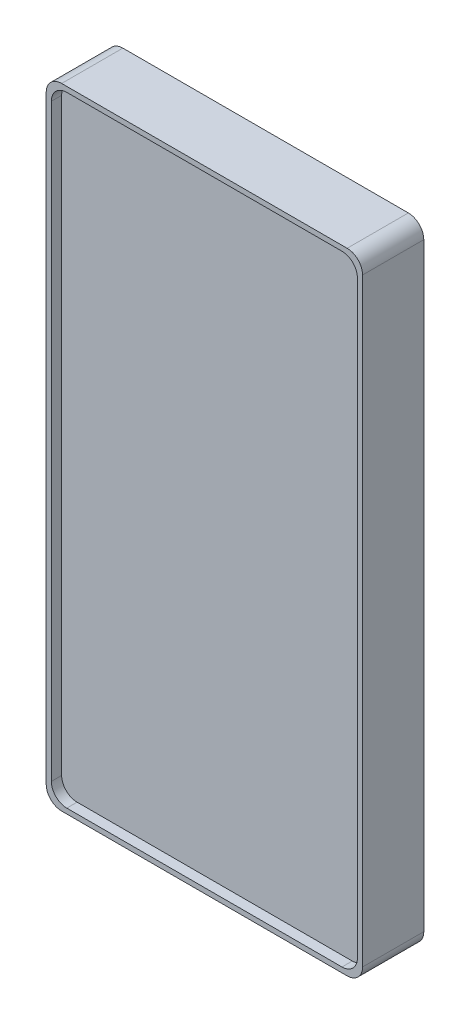
ISO-10303-21;
HEADER;
FILE_DESCRIPTION(('STEP AP214'),'2;1');
FILE_NAME('part.step','',(''),(''),'','','');
FILE_SCHEMA(('AUTOMOTIVE_DESIGN { 1 0 10303 214 1 1 1 1 }'));
ENDSEC;
DATA;
#1=APPLICATION_CONTEXT('core data for automotive mechanical design processes');
#2=APPLICATION_PROTOCOL_DEFINITION('international standard','automotive_design',2000,#1);
#3=PRODUCT_CONTEXT('',#1,'mechanical');
#4=PRODUCT('Part','Part','',(#3));
#5=PRODUCT_RELATED_PRODUCT_CATEGORY('part','',(#4));
#6=PRODUCT_DEFINITION_FORMATION('','',#4);
#7=PRODUCT_DEFINITION_CONTEXT('part definition',#1,'design');
#8=PRODUCT_DEFINITION('design','',#6,#7);
#9=PRODUCT_DEFINITION_SHAPE('','',#8);
#10=(LENGTH_UNIT() NAMED_UNIT(*) SI_UNIT(.MILLI.,.METRE.));
#11=(NAMED_UNIT(*) PLANE_ANGLE_UNIT() SI_UNIT($,.RADIAN.));
#12=(NAMED_UNIT(*) SI_UNIT($,.STERADIAN.) SOLID_ANGLE_UNIT());
#13=UNCERTAINTY_MEASURE_WITH_UNIT(LENGTH_MEASURE(1.E-05),#10,'distance_accuracy_value','');
#14=(GEOMETRIC_REPRESENTATION_CONTEXT(3) GLOBAL_UNCERTAINTY_ASSIGNED_CONTEXT((#13)) GLOBAL_UNIT_ASSIGNED_CONTEXT((#10,
#11,#12)) REPRESENTATION_CONTEXT('',''));
#15=CARTESIAN_POINT('',(0.,0.,0.));
#16=DIRECTION('',(0.,0.,1.));
#17=DIRECTION('',(1.,0.,0.));
#18=AXIS2_PLACEMENT_3D('',#15,#16,#17);
#19=CARTESIAN_POINT('',(0.,0.,119.));
#20=DIRECTION('',(-1.,0.,0.));
#21=DIRECTION('',(0.,-1.,0.));
#22=AXIS2_PLACEMENT_3D('',#19,#20,#21);
#23=PLANE('',#22);
#24=DIRECTION('',(0.,1.,0.));
#25=VECTOR('',#24,1.);
#26=CARTESIAN_POINT('',(0.,0.,0.));
#27=LINE('',#26,#25);
#28=CARTESIAN_POINT('',(0.,30.,0.));
#29=VERTEX_POINT('',#28);
#30=CARTESIAN_POINT('',(0.,1195.,0.));
#31=VERTEX_POINT('',#30);
#32=EDGE_CURVE('E195',#29,#31,#27,.T.);
#33=ORIENTED_EDGE('',*,*,#32,.T.);
#34=DIRECTION('',(0.,0.,-1.));
#35=VECTOR('',#34,1.);
#36=CARTESIAN_POINT('',(0.,1195.,119.));
#37=LINE('',#36,#35);
#38=CARTESIAN_POINT('',(0.,1195.,119.));
#39=VERTEX_POINT('',#38);
#40=EDGE_CURVE('E256',#31,#39,#37,.F.);
#41=ORIENTED_EDGE('',*,*,#40,.T.);
#42=DIRECTION('',(0.,1.,0.));
#43=VECTOR('',#42,1.);
#44=CARTESIAN_POINT('',(0.,0.,119.));
#45=LINE('',#44,#43);
#46=CARTESIAN_POINT('',(0.,30.,119.));
#47=VERTEX_POINT('',#46);
#48=EDGE_CURVE('E184',#47,#39,#45,.T.);
#49=ORIENTED_EDGE('',*,*,#48,.F.);
#50=DIRECTION('',(0.,0.,-1.));
#51=VECTOR('',#50,1.);
#52=CARTESIAN_POINT('',(0.,30.,119.));
#53=LINE('',#52,#51);
#54=EDGE_CURVE('E253',#47,#29,#53,.T.);
#55=ORIENTED_EDGE('',*,*,#54,.T.);
#56=EDGE_LOOP('',(#33,#41,#49,#55));
#57=FACE_BOUND('',#56,.T.);
#58=ADVANCED_FACE('F33',(#57),#23,.F.);
#59=CARTESIAN_POINT('',(0.,1225.,119.));
#60=DIRECTION('',(0.,-1.,0.));
#61=DIRECTION('',(0.,0.,-1.));
#62=AXIS2_PLACEMENT_3D('',#59,#60,#61);
#63=PLANE('',#62);
#64=DIRECTION('',(-1.,0.,0.));
#65=VECTOR('',#64,1.);
#66=CARTESIAN_POINT('',(0.,1225.,0.));
#67=LINE('',#66,#65);
#68=CARTESIAN_POINT('',(-30.,1225.,0.));
#69=VERTEX_POINT('',#68);
#70=CARTESIAN_POINT('',(-585.,1225.,0.));
#71=VERTEX_POINT('',#70);
#72=EDGE_CURVE('E198',#69,#71,#67,.T.);
#73=ORIENTED_EDGE('',*,*,#72,.T.);
#74=DIRECTION('',(0.,0.,-1.));
#75=VECTOR('',#74,1.);
#76=CARTESIAN_POINT('',(-585.,1225.,119.));
#77=LINE('',#76,#75);
#78=CARTESIAN_POINT('',(-585.,1225.,119.));
#79=VERTEX_POINT('',#78);
#80=EDGE_CURVE('E244',#71,#79,#77,.F.);
#81=ORIENTED_EDGE('',*,*,#80,.T.);
#82=DIRECTION('',(-1.,0.,0.));
#83=VECTOR('',#82,1.);
#84=CARTESIAN_POINT('',(0.,1225.,119.));
#85=LINE('',#84,#83);
#86=CARTESIAN_POINT('',(-30.,1225.,119.));
#87=VERTEX_POINT('',#86);
#88=EDGE_CURVE('E187',#87,#79,#85,.T.);
#89=ORIENTED_EDGE('',*,*,#88,.F.);
#90=DIRECTION('',(0.,0.,-1.));
#91=VECTOR('',#90,1.);
#92=CARTESIAN_POINT('',(-30.,1225.,119.));
#93=LINE('',#92,#91);
#94=EDGE_CURVE('E241',#87,#69,#93,.T.);
#95=ORIENTED_EDGE('',*,*,#94,.T.);
#96=EDGE_LOOP('',(#73,#81,#89,#95));
#97=FACE_BOUND('',#96,.T.);
#98=ADVANCED_FACE('F304',(#97),#63,.F.);
#99=CARTESIAN_POINT('',(-615.,0.,119.));
#100=DIRECTION('',(1.,0.,0.));
#101=DIRECTION('',(0.,0.,-1.));
#102=AXIS2_PLACEMENT_3D('',#99,#100,#101);
#103=PLANE('',#102);
#104=DIRECTION('',(0.,-1.,0.));
#105=VECTOR('',#104,1.);
#106=CARTESIAN_POINT('',(-615.,0.,119.));
#107=LINE('',#106,#105);
#108=CARTESIAN_POINT('',(-615.,1195.,119.));
#109=VERTEX_POINT('',#108);
#110=CARTESIAN_POINT('',(-615.,29.9999999999999,119.));
#111=VERTEX_POINT('',#110);
#112=EDGE_CURVE('E191',#109,#111,#107,.T.);
#113=ORIENTED_EDGE('',*,*,#112,.F.);
#114=DIRECTION('',(0.,0.,-1.));
#115=VECTOR('',#114,1.);
#116=CARTESIAN_POINT('',(-615.,1195.,119.));
#117=LINE('',#116,#115);
#118=CARTESIAN_POINT('',(-615.,1195.,0.));
#119=VERTEX_POINT('',#118);
#120=EDGE_CURVE('E230',#109,#119,#117,.T.);
#121=ORIENTED_EDGE('',*,*,#120,.T.);
#122=DIRECTION('',(0.,-1.,0.));
#123=VECTOR('',#122,1.);
#124=CARTESIAN_POINT('',(-615.,0.,0.));
#125=LINE('',#124,#123);
#126=CARTESIAN_POINT('',(-615.,29.9999999999999,0.));
#127=VERTEX_POINT('',#126);
#128=EDGE_CURVE('E202',#119,#127,#125,.T.);
#129=ORIENTED_EDGE('',*,*,#128,.T.);
#130=DIRECTION('',(0.,0.,-1.));
#131=VECTOR('',#130,1.);
#132=CARTESIAN_POINT('',(-615.,29.9999999999999,119.));
#133=LINE('',#132,#131);
#134=EDGE_CURVE('E228',#127,#111,#133,.F.);
#135=ORIENTED_EDGE('',*,*,#134,.T.);
#136=EDGE_LOOP('',(#113,#121,#129,#135));
#137=FACE_BOUND('',#136,.T.);
#138=ADVANCED_FACE('F310',(#137),#103,.F.);
#139=CARTESIAN_POINT('',(0.,0.,119.));
#140=DIRECTION('',(0.,1.,0.));
#141=DIRECTION('',(-1.,0.,0.));
#142=AXIS2_PLACEMENT_3D('',#139,#140,#141);
#143=PLANE('',#142);
#144=DIRECTION('',(1.,0.,0.));
#145=VECTOR('',#144,1.);
#146=CARTESIAN_POINT('',(0.,0.,0.));
#147=LINE('',#146,#145);
#148=CARTESIAN_POINT('',(-585.,0.,0.));
#149=VERTEX_POINT('',#148);
#150=CARTESIAN_POINT('',(-30.,0.,0.));
#151=VERTEX_POINT('',#150);
#152=EDGE_CURVE('E188',#149,#151,#147,.T.);
#153=ORIENTED_EDGE('',*,*,#152,.T.);
#154=DIRECTION('',(0.,0.,-1.));
#155=VECTOR('',#154,1.);
#156=CARTESIAN_POINT('',(-30.,0.,119.));
#157=LINE('',#156,#155);
#158=CARTESIAN_POINT('',(-30.,0.,119.));
#159=VERTEX_POINT('',#158);
#160=EDGE_CURVE('E48',#151,#159,#157,.F.);
#161=ORIENTED_EDGE('',*,*,#160,.T.);
#162=DIRECTION('',(1.,0.,0.));
#163=VECTOR('',#162,1.);
#164=CARTESIAN_POINT('',(0.,0.,119.));
#165=LINE('',#164,#163);
#166=CARTESIAN_POINT('',(-585.,0.,119.));
#167=VERTEX_POINT('',#166);
#168=EDGE_CURVE('E193',#167,#159,#165,.T.);
#169=ORIENTED_EDGE('',*,*,#168,.F.);
#170=DIRECTION('',(0.,0.,-1.));
#171=VECTOR('',#170,1.);
#172=CARTESIAN_POINT('',(-585.,0.,119.));
#173=LINE('',#172,#171);
#174=EDGE_CURVE('E258',#167,#149,#173,.T.);
#175=ORIENTED_EDGE('',*,*,#174,.T.);
#176=EDGE_LOOP('',(#153,#161,#169,#175));
#177=FACE_BOUND('',#176,.T.);
#178=ADVANCED_FACE('F316',(#177),#143,.F.);
#179=CARTESIAN_POINT('',(0.,0.,119.));
#180=DIRECTION('',(0.,0.,1.));
#181=DIRECTION('',(1.,0.,0.));
#182=AXIS2_PLACEMENT_3D('',#179,#180,#181);
#183=PLANE('',#182);
#184=DIRECTION('',(0.,1.,0.));
#185=VECTOR('',#184,1.);
#186=CARTESIAN_POINT('',(-10.,9.99999999999993,119.));
#187=LINE('',#186,#185);
#188=CARTESIAN_POINT('',(-10.,39.9999999999999,119.));
#189=VERTEX_POINT('',#188);
#190=CARTESIAN_POINT('',(-10.,1185.,119.));
#191=VERTEX_POINT('',#190);
#192=EDGE_CURVE('E173',#189,#191,#187,.T.);
#193=ORIENTED_EDGE('',*,*,#192,.F.);
#194=CARTESIAN_POINT('',(-40.,39.9999999999999,119.));
#195=DIRECTION('',(0.,0.,1.));
#196=DIRECTION('',(1.,0.,0.));
#197=AXIS2_PLACEMENT_3D('',#194,#195,#196);
#198=CIRCLE('',#197,30.);
#199=CARTESIAN_POINT('',(-40.,9.99999999999992,119.));
#200=VERTEX_POINT('',#199);
#201=EDGE_CURVE('E41',#189,#200,#198,.F.);
#202=ORIENTED_EDGE('',*,*,#201,.T.);
#203=DIRECTION('',(1.,0.,0.));
#204=VECTOR('',#203,1.);
#205=CARTESIAN_POINT('',(-10.,9.99999999999993,119.));
#206=LINE('',#205,#204);
#207=CARTESIAN_POINT('',(-575.,9.99999999999986,119.));
#208=VERTEX_POINT('',#207);
#209=EDGE_CURVE('E176',#208,#200,#206,.T.);
#210=ORIENTED_EDGE('',*,*,#209,.F.);
#211=CARTESIAN_POINT('',(-575.,39.9999999999999,119.));
#212=DIRECTION('',(0.,0.,1.));
#213=DIRECTION('',(1.,0.,0.));
#214=AXIS2_PLACEMENT_3D('',#211,#212,#213);
#215=CIRCLE('',#214,30.);
#216=CARTESIAN_POINT('',(-605.,39.9999999999999,119.));
#217=VERTEX_POINT('',#216);
#218=EDGE_CURVE('E11',#208,#217,#215,.F.);
#219=ORIENTED_EDGE('',*,*,#218,.T.);
#220=DIRECTION('',(0.,-1.,0.));
#221=VECTOR('',#220,1.);
#222=CARTESIAN_POINT('',(-605.,9.99999999999985,119.));
#223=LINE('',#222,#221);
#224=CARTESIAN_POINT('',(-605.,1185.,119.));
#225=VERTEX_POINT('',#224);
#226=EDGE_CURVE('E172',#225,#217,#223,.T.);
#227=ORIENTED_EDGE('',*,*,#226,.F.);
#228=CARTESIAN_POINT('',(-575.,1185.,119.));
#229=DIRECTION('',(0.,0.,1.));
#230=DIRECTION('',(1.,0.,0.));
#231=AXIS2_PLACEMENT_3D('',#228,#229,#230);
#232=CIRCLE('',#231,30.);
#233=CARTESIAN_POINT('',(-575.,1215.,119.));
#234=VERTEX_POINT('',#233);
#235=EDGE_CURVE('E157',#225,#234,#232,.F.);
#236=ORIENTED_EDGE('',*,*,#235,.T.);
#237=DIRECTION('',(-1.,0.,0.));
#238=VECTOR('',#237,1.);
#239=CARTESIAN_POINT('',(-10.,1215.,119.));
#240=LINE('',#239,#238);
#241=CARTESIAN_POINT('',(-40.,1215.,119.));
#242=VERTEX_POINT('',#241);
#243=EDGE_CURVE('E163',#242,#234,#240,.T.);
#244=ORIENTED_EDGE('',*,*,#243,.F.);
#245=CARTESIAN_POINT('',(-40.,1185.,119.));
#246=DIRECTION('',(0.,0.,1.));
#247=DIRECTION('',(1.,0.,0.));
#248=AXIS2_PLACEMENT_3D('',#245,#246,#247);
#249=CIRCLE('',#248,30.);
#250=EDGE_CURVE('E147',#242,#191,#249,.F.);
#251=ORIENTED_EDGE('',*,*,#250,.T.);
#252=EDGE_LOOP('',(#193,#202,#210,#219,#227,#236,#244,#251));
#253=FACE_BOUND('',#252,.T.);
#254=ORIENTED_EDGE('',*,*,#88,.T.);
#255=CARTESIAN_POINT('',(-585.,1195.,119.));
#256=DIRECTION('',(0.,0.,1.));
#257=DIRECTION('',(1.,0.,0.));
#258=AXIS2_PLACEMENT_3D('',#255,#256,#257);
#259=CIRCLE('',#258,30.);
#260=EDGE_CURVE('E251',#79,#109,#259,.T.);
#261=ORIENTED_EDGE('',*,*,#260,.T.);
#262=ORIENTED_EDGE('',*,*,#112,.T.);
#263=CARTESIAN_POINT('',(-585.,29.9999999999999,119.));
#264=DIRECTION('',(0.,0.,1.));
#265=DIRECTION('',(1.,0.,0.));
#266=AXIS2_PLACEMENT_3D('',#263,#264,#265);
#267=CIRCLE('',#266,30.);
#268=EDGE_CURVE('E55',#111,#167,#267,.T.);
#269=ORIENTED_EDGE('',*,*,#268,.T.);
#270=ORIENTED_EDGE('',*,*,#168,.T.);
#271=CARTESIAN_POINT('',(-30.,30.,119.));
#272=DIRECTION('',(0.,0.,1.));
#273=DIRECTION('',(1.,0.,0.));
#274=AXIS2_PLACEMENT_3D('',#271,#272,#273);
#275=CIRCLE('',#274,30.);
#276=EDGE_CURVE('E247',#159,#47,#275,.T.);
#277=ORIENTED_EDGE('',*,*,#276,.T.);
#278=ORIENTED_EDGE('',*,*,#48,.T.);
#279=CARTESIAN_POINT('',(-30.,1195.,119.));
#280=DIRECTION('',(0.,0.,1.));
#281=DIRECTION('',(1.,0.,0.));
#282=AXIS2_PLACEMENT_3D('',#279,#280,#281);
#283=CIRCLE('',#282,30.);
#284=EDGE_CURVE('E249',#39,#87,#283,.T.);
#285=ORIENTED_EDGE('',*,*,#284,.T.);
#286=EDGE_LOOP('',(#254,#261,#262,#269,#270,#277,#278,#285));
#287=FACE_BOUND('',#286,.T.);
#288=ADVANCED_FACE('F170',(#253,#287),#183,.T.);
#289=CARTESIAN_POINT('',(0.,0.,0.));
#290=DIRECTION('',(0.,0.,1.));
#291=DIRECTION('',(1.,0.,0.));
#292=AXIS2_PLACEMENT_3D('',#289,#290,#291);
#293=PLANE('',#292);
#294=ORIENTED_EDGE('',*,*,#128,.F.);
#295=CARTESIAN_POINT('',(-585.,1195.,0.));
#296=DIRECTION('',(0.,0.,1.));
#297=DIRECTION('',(1.,0.,0.));
#298=AXIS2_PLACEMENT_3D('',#295,#296,#297);
#299=CIRCLE('',#298,30.);
#300=EDGE_CURVE('E239',#119,#71,#299,.F.);
#301=ORIENTED_EDGE('',*,*,#300,.T.);
#302=ORIENTED_EDGE('',*,*,#72,.F.);
#303=CARTESIAN_POINT('',(-30.,1195.,0.));
#304=DIRECTION('',(0.,0.,1.));
#305=DIRECTION('',(1.,0.,0.));
#306=AXIS2_PLACEMENT_3D('',#303,#304,#305);
#307=CIRCLE('',#306,30.);
#308=EDGE_CURVE('E237',#69,#31,#307,.F.);
#309=ORIENTED_EDGE('',*,*,#308,.T.);
#310=ORIENTED_EDGE('',*,*,#32,.F.);
#311=CARTESIAN_POINT('',(-30.,30.,0.));
#312=DIRECTION('',(0.,0.,1.));
#313=DIRECTION('',(1.,0.,0.));
#314=AXIS2_PLACEMENT_3D('',#311,#312,#313);
#315=CIRCLE('',#314,30.);
#316=EDGE_CURVE('E235',#29,#151,#315,.F.);
#317=ORIENTED_EDGE('',*,*,#316,.T.);
#318=ORIENTED_EDGE('',*,*,#152,.F.);
#319=CARTESIAN_POINT('',(-585.,29.9999999999999,0.));
#320=DIRECTION('',(0.,0.,1.));
#321=DIRECTION('',(1.,0.,0.));
#322=AXIS2_PLACEMENT_3D('',#319,#320,#321);
#323=CIRCLE('',#322,30.);
#324=EDGE_CURVE('E233',#149,#127,#323,.F.);
#325=ORIENTED_EDGE('',*,*,#324,.T.);
#326=EDGE_LOOP('',(#294,#301,#302,#309,#310,#317,#318,#325));
#327=FACE_BOUND('',#326,.T.);
#328=ADVANCED_FACE('F320',(#327),#293,.F.);
#329=CARTESIAN_POINT('',(-10.,9.99999999999993,99.));
#330=DIRECTION('',(1.,0.,0.));
#331=DIRECTION('',(0.,0.,-1.));
#332=AXIS2_PLACEMENT_3D('',#329,#330,#331);
#333=PLANE('',#332);
#334=ORIENTED_EDGE('',*,*,#192,.T.);
#335=DIRECTION('',(0.,0.,1.));
#336=VECTOR('',#335,1.);
#337=CARTESIAN_POINT('',(-10.,1185.,99.));
#338=LINE('',#337,#336);
#339=CARTESIAN_POINT('',(-10.,1185.,99.));
#340=VERTEX_POINT('',#339);
#341=EDGE_CURVE('E152',#191,#340,#338,.F.);
#342=ORIENTED_EDGE('',*,*,#341,.T.);
#343=DIRECTION('',(0.,1.,0.));
#344=VECTOR('',#343,1.);
#345=CARTESIAN_POINT('',(-10.,9.99999999999993,99.));
#346=LINE('',#345,#344);
#347=CARTESIAN_POINT('',(-10.,39.9999999999999,99.));
#348=VERTEX_POINT('',#347);
#349=EDGE_CURVE('E183',#348,#340,#346,.T.);
#350=ORIENTED_EDGE('',*,*,#349,.F.);
#351=DIRECTION('',(0.,0.,1.));
#352=VECTOR('',#351,1.);
#353=CARTESIAN_POINT('',(-10.,39.9999999999999,119.));
#354=LINE('',#353,#352);
#355=EDGE_CURVE('E167',#348,#189,#354,.T.);
#356=ORIENTED_EDGE('',*,*,#355,.T.);
#357=EDGE_LOOP('',(#334,#342,#350,#356));
#358=FACE_BOUND('',#357,.T.);
#359=ADVANCED_FACE('F278',(#358),#333,.F.);
#360=CARTESIAN_POINT('',(-10.,9.99999999999993,99.));
#361=DIRECTION('',(0.,-1.,0.));
#362=DIRECTION('',(1.,0.,0.));
#363=AXIS2_PLACEMENT_3D('',#360,#361,#362);
#364=PLANE('',#363);
#365=ORIENTED_EDGE('',*,*,#209,.T.);
#366=DIRECTION('',(0.,0.,1.));
#367=VECTOR('',#366,1.);
#368=CARTESIAN_POINT('',(-40.,9.99999999999992,99.));
#369=LINE('',#368,#367);
#370=CARTESIAN_POINT('',(-40.,9.99999999999992,99.));
#371=VERTEX_POINT('',#370);
#372=EDGE_CURVE('E226',#200,#371,#369,.F.);
#373=ORIENTED_EDGE('',*,*,#372,.T.);
#374=DIRECTION('',(1.,0.,0.));
#375=VECTOR('',#374,1.);
#376=CARTESIAN_POINT('',(-10.,9.99999999999993,99.));
#377=LINE('',#376,#375);
#378=CARTESIAN_POINT('',(-575.,9.99999999999986,99.));
#379=VERTEX_POINT('',#378);
#380=EDGE_CURVE('E199',#379,#371,#377,.T.);
#381=ORIENTED_EDGE('',*,*,#380,.F.);
#382=DIRECTION('',(0.,0.,1.));
#383=VECTOR('',#382,1.);
#384=CARTESIAN_POINT('',(-575.,9.99999999999986,119.));
#385=LINE('',#384,#383);
#386=EDGE_CURVE('E223',#379,#208,#385,.T.);
#387=ORIENTED_EDGE('',*,*,#386,.T.);
#388=EDGE_LOOP('',(#365,#373,#381,#387));
#389=FACE_BOUND('',#388,.T.);
#390=ADVANCED_FACE('F267',(#389),#364,.F.);
#391=CARTESIAN_POINT('',(-605.,9.99999999999985,99.));
#392=DIRECTION('',(-1.,0.,0.));
#393=DIRECTION('',(0.,0.,1.));
#394=AXIS2_PLACEMENT_3D('',#391,#392,#393);
#395=PLANE('',#394);
#396=DIRECTION('',(0.,-1.,0.));
#397=VECTOR('',#396,1.);
#398=CARTESIAN_POINT('',(-605.,9.99999999999985,99.));
#399=LINE('',#398,#397);
#400=CARTESIAN_POINT('',(-605.,1185.,99.));
#401=VERTEX_POINT('',#400);
#402=CARTESIAN_POINT('',(-605.,39.9999999999999,99.));
#403=VERTEX_POINT('',#402);
#404=EDGE_CURVE('E280',#401,#403,#399,.T.);
#405=ORIENTED_EDGE('',*,*,#404,.F.);
#406=DIRECTION('',(0.,0.,1.));
#407=VECTOR('',#406,1.);
#408=CARTESIAN_POINT('',(-605.,1185.,119.));
#409=LINE('',#408,#407);
#410=EDGE_CURVE('E220',#401,#225,#409,.T.);
#411=ORIENTED_EDGE('',*,*,#410,.T.);
#412=ORIENTED_EDGE('',*,*,#226,.T.);
#413=DIRECTION('',(0.,0.,1.));
#414=VECTOR('',#413,1.);
#415=CARTESIAN_POINT('',(-605.,39.9999999999999,99.));
#416=LINE('',#415,#414);
#417=EDGE_CURVE('E218',#217,#403,#416,.F.);
#418=ORIENTED_EDGE('',*,*,#417,.T.);
#419=EDGE_LOOP('',(#405,#411,#412,#418));
#420=FACE_BOUND('',#419,.T.);
#421=ADVANCED_FACE('F292',(#420),#395,.F.);
#422=CARTESIAN_POINT('',(-10.,1215.,99.));
#423=DIRECTION('',(0.,1.,0.));
#424=DIRECTION('',(0.,0.,1.));
#425=AXIS2_PLACEMENT_3D('',#422,#423,#424);
#426=PLANE('',#425);
#427=DIRECTION('',(-1.,0.,0.));
#428=VECTOR('',#427,1.);
#429=CARTESIAN_POINT('',(-10.,1215.,99.));
#430=LINE('',#429,#428);
#431=CARTESIAN_POINT('',(-40.,1215.,99.));
#432=VERTEX_POINT('',#431);
#433=CARTESIAN_POINT('',(-575.,1215.,99.));
#434=VERTEX_POINT('',#433);
#435=EDGE_CURVE('E166',#432,#434,#430,.T.);
#436=ORIENTED_EDGE('',*,*,#435,.F.);
#437=DIRECTION('',(0.,0.,1.));
#438=VECTOR('',#437,1.);
#439=CARTESIAN_POINT('',(-40.,1215.,119.));
#440=LINE('',#439,#438);
#441=EDGE_CURVE('E151',#432,#242,#440,.T.);
#442=ORIENTED_EDGE('',*,*,#441,.T.);
#443=ORIENTED_EDGE('',*,*,#243,.T.);
#444=DIRECTION('',(0.,0.,1.));
#445=VECTOR('',#444,1.);
#446=CARTESIAN_POINT('',(-575.,1215.,99.));
#447=LINE('',#446,#445);
#448=EDGE_CURVE('E168',#234,#434,#447,.F.);
#449=ORIENTED_EDGE('',*,*,#448,.T.);
#450=EDGE_LOOP('',(#436,#442,#443,#449));
#451=FACE_BOUND('',#450,.T.);
#452=ADVANCED_FACE('F162',(#451),#426,.F.);
#453=CARTESIAN_POINT('',(0.,0.,99.));
#454=DIRECTION('',(0.,0.,1.));
#455=DIRECTION('',(1.,0.,0.));
#456=AXIS2_PLACEMENT_3D('',#453,#454,#455);
#457=PLANE('',#456);
#458=ORIENTED_EDGE('',*,*,#349,.T.);
#459=CARTESIAN_POINT('',(-40.,1185.,99.));
#460=DIRECTION('',(0.,0.,1.));
#461=DIRECTION('',(1.,0.,0.));
#462=AXIS2_PLACEMENT_3D('',#459,#460,#461);
#463=CIRCLE('',#462,30.);
#464=EDGE_CURVE('E216',#340,#432,#463,.T.);
#465=ORIENTED_EDGE('',*,*,#464,.T.);
#466=ORIENTED_EDGE('',*,*,#435,.T.);
#467=CARTESIAN_POINT('',(-575.,1185.,99.));
#468=DIRECTION('',(0.,0.,1.));
#469=DIRECTION('',(1.,0.,0.));
#470=AXIS2_PLACEMENT_3D('',#467,#468,#469);
#471=CIRCLE('',#470,30.);
#472=EDGE_CURVE('E214',#434,#401,#471,.T.);
#473=ORIENTED_EDGE('',*,*,#472,.T.);
#474=ORIENTED_EDGE('',*,*,#404,.T.);
#475=CARTESIAN_POINT('',(-575.,39.9999999999999,99.));
#476=DIRECTION('',(0.,0.,1.));
#477=DIRECTION('',(1.,0.,0.));
#478=AXIS2_PLACEMENT_3D('',#475,#476,#477);
#479=CIRCLE('',#478,30.);
#480=EDGE_CURVE('E210',#403,#379,#479,.T.);
#481=ORIENTED_EDGE('',*,*,#480,.T.);
#482=ORIENTED_EDGE('',*,*,#380,.T.);
#483=CARTESIAN_POINT('',(-40.,39.9999999999999,99.));
#484=DIRECTION('',(0.,0.,1.));
#485=DIRECTION('',(1.,0.,0.));
#486=AXIS2_PLACEMENT_3D('',#483,#484,#485);
#487=CIRCLE('',#486,30.);
#488=EDGE_CURVE('E212',#371,#348,#487,.T.);
#489=ORIENTED_EDGE('',*,*,#488,.T.);
#490=EDGE_LOOP('',(#458,#465,#466,#473,#474,#481,#482,#489));
#491=FACE_BOUND('',#490,.T.);
#492=ADVANCED_FACE('F276',(#491),#457,.T.);
#493=CARTESIAN_POINT('',(-40.,1185.,99.));
#494=DIRECTION('',(0.,0.,-1.));
#495=DIRECTION('',(-1.,0.,0.));
#496=AXIS2_PLACEMENT_3D('',#493,#494,#495);
#497=CYLINDRICAL_SURFACE('',#496,30.);
#498=ORIENTED_EDGE('',*,*,#464,.F.);
#499=ORIENTED_EDGE('',*,*,#341,.F.);
#500=ORIENTED_EDGE('',*,*,#250,.F.);
#501=ORIENTED_EDGE('',*,*,#441,.F.);
#502=EDGE_LOOP('',(#498,#499,#500,#501));
#503=FACE_BOUND('',#502,.T.);
#504=ADVANCED_FACE('F150',(#503),#497,.F.);
#505=CARTESIAN_POINT('',(-575.,1185.,99.));
#506=DIRECTION('',(0.,0.,-1.));
#507=DIRECTION('',(-1.,0.,0.));
#508=AXIS2_PLACEMENT_3D('',#505,#506,#507);
#509=CYLINDRICAL_SURFACE('',#508,30.);
#510=ORIENTED_EDGE('',*,*,#472,.F.);
#511=ORIENTED_EDGE('',*,*,#448,.F.);
#512=ORIENTED_EDGE('',*,*,#235,.F.);
#513=ORIENTED_EDGE('',*,*,#410,.F.);
#514=EDGE_LOOP('',(#510,#511,#512,#513));
#515=FACE_BOUND('',#514,.T.);
#516=ADVANCED_FACE('F294',(#515),#509,.F.);
#517=CARTESIAN_POINT('',(-40.,39.9999999999999,99.));
#518=DIRECTION('',(0.,0.,-1.));
#519=DIRECTION('',(-1.,0.,0.));
#520=AXIS2_PLACEMENT_3D('',#517,#518,#519);
#521=CYLINDRICAL_SURFACE('',#520,30.);
#522=ORIENTED_EDGE('',*,*,#488,.F.);
#523=ORIENTED_EDGE('',*,*,#372,.F.);
#524=ORIENTED_EDGE('',*,*,#201,.F.);
#525=ORIENTED_EDGE('',*,*,#355,.F.);
#526=EDGE_LOOP('',(#522,#523,#524,#525));
#527=FACE_BOUND('',#526,.T.);
#528=ADVANCED_FACE('F272',(#527),#521,.F.);
#529=CARTESIAN_POINT('',(-575.,39.9999999999999,99.));
#530=DIRECTION('',(0.,0.,-1.));
#531=DIRECTION('',(-1.,0.,0.));
#532=AXIS2_PLACEMENT_3D('',#529,#530,#531);
#533=CYLINDRICAL_SURFACE('',#532,30.);
#534=ORIENTED_EDGE('',*,*,#480,.F.);
#535=ORIENTED_EDGE('',*,*,#417,.F.);
#536=ORIENTED_EDGE('',*,*,#218,.F.);
#537=ORIENTED_EDGE('',*,*,#386,.F.);
#538=EDGE_LOOP('',(#534,#535,#536,#537));
#539=FACE_BOUND('',#538,.T.);
#540=ADVANCED_FACE('F291',(#539),#533,.F.);
#541=CARTESIAN_POINT('',(-585.,1195.,119.));
#542=DIRECTION('',(0.,0.,-1.));
#543=DIRECTION('',(-1.,0.,0.));
#544=AXIS2_PLACEMENT_3D('',#541,#542,#543);
#545=CYLINDRICAL_SURFACE('',#544,30.);
#546=ORIENTED_EDGE('',*,*,#260,.F.);
#547=ORIENTED_EDGE('',*,*,#80,.F.);
#548=ORIENTED_EDGE('',*,*,#300,.F.);
#549=ORIENTED_EDGE('',*,*,#120,.F.);
#550=EDGE_LOOP('',(#546,#547,#548,#549));
#551=FACE_BOUND('',#550,.T.);
#552=ADVANCED_FACE('F362',(#551),#545,.T.);
#553=CARTESIAN_POINT('',(-30.,1195.,119.));
#554=DIRECTION('',(0.,0.,-1.));
#555=DIRECTION('',(-1.,0.,0.));
#556=AXIS2_PLACEMENT_3D('',#553,#554,#555);
#557=CYLINDRICAL_SURFACE('',#556,30.);
#558=ORIENTED_EDGE('',*,*,#284,.F.);
#559=ORIENTED_EDGE('',*,*,#40,.F.);
#560=ORIENTED_EDGE('',*,*,#308,.F.);
#561=ORIENTED_EDGE('',*,*,#94,.F.);
#562=EDGE_LOOP('',(#558,#559,#560,#561));
#563=FACE_BOUND('',#562,.T.);
#564=ADVANCED_FACE('F371',(#563),#557,.T.);
#565=CARTESIAN_POINT('',(-30.,30.,119.));
#566=DIRECTION('',(0.,0.,-1.));
#567=DIRECTION('',(-1.,0.,0.));
#568=AXIS2_PLACEMENT_3D('',#565,#566,#567);
#569=CYLINDRICAL_SURFACE('',#568,30.);
#570=ORIENTED_EDGE('',*,*,#276,.F.);
#571=ORIENTED_EDGE('',*,*,#160,.F.);
#572=ORIENTED_EDGE('',*,*,#316,.F.);
#573=ORIENTED_EDGE('',*,*,#54,.F.);
#574=EDGE_LOOP('',(#570,#571,#572,#573));
#575=FACE_BOUND('',#574,.T.);
#576=ADVANCED_FACE('F381',(#575),#569,.T.);
#577=CARTESIAN_POINT('',(-585.,29.9999999999999,119.));
#578=DIRECTION('',(0.,0.,-1.));
#579=DIRECTION('',(-1.,0.,0.));
#580=AXIS2_PLACEMENT_3D('',#577,#578,#579);
#581=CYLINDRICAL_SURFACE('',#580,30.);
#582=ORIENTED_EDGE('',*,*,#268,.F.);
#583=ORIENTED_EDGE('',*,*,#134,.F.);
#584=ORIENTED_EDGE('',*,*,#324,.F.);
#585=ORIENTED_EDGE('',*,*,#174,.F.);
#586=EDGE_LOOP('',(#582,#583,#584,#585));
#587=FACE_BOUND('',#586,.T.);
#588=ADVANCED_FACE('F35',(#587),#581,.T.);
#589=CLOSED_SHELL('',(#58,#98,#138,#178,#288,#328,#359,#390,#421,#452,#492,#504,#516,#528,#540,
#552,#564,#576,#588));
#590=MANIFOLD_SOLID_BREP('B2',#589);
#591=ADVANCED_BREP_SHAPE_REPRESENTATION('',(#18,#590),#14);
#592=SHAPE_DEFINITION_REPRESENTATION(#9,#591);
ENDSEC;
END-ISO-10303-21;
